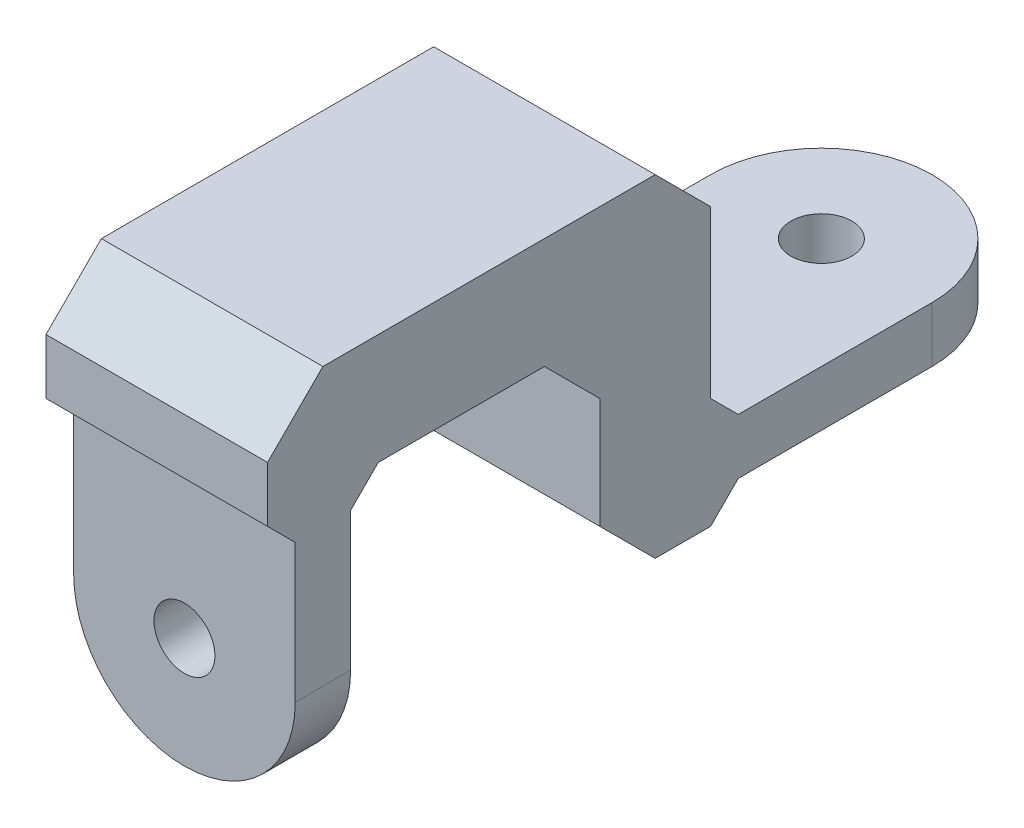
ISO-10303-21;
HEADER;
FILE_DESCRIPTION(('STEP AP214'),'2;1');
FILE_NAME('part.step','',(''),(''),'','','');
FILE_SCHEMA(('AUTOMOTIVE_DESIGN { 1 0 10303 214 1 1 1 1 }'));
ENDSEC;
DATA;
#1=APPLICATION_CONTEXT('core data for automotive mechanical design processes');
#2=APPLICATION_PROTOCOL_DEFINITION('international standard','automotive_design',2000,#1);
#3=PRODUCT_CONTEXT('',#1,'mechanical');
#4=PRODUCT('Part','Part','',(#3));
#5=PRODUCT_RELATED_PRODUCT_CATEGORY('part','',(#4));
#6=PRODUCT_DEFINITION_FORMATION('','',#4);
#7=PRODUCT_DEFINITION_CONTEXT('part definition',#1,'design');
#8=PRODUCT_DEFINITION('design','',#6,#7);
#9=PRODUCT_DEFINITION_SHAPE('','',#8);
#10=(LENGTH_UNIT() NAMED_UNIT(*) SI_UNIT(.MILLI.,.METRE.));
#11=(NAMED_UNIT(*) PLANE_ANGLE_UNIT() SI_UNIT($,.RADIAN.));
#12=(NAMED_UNIT(*) SI_UNIT($,.STERADIAN.) SOLID_ANGLE_UNIT());
#13=UNCERTAINTY_MEASURE_WITH_UNIT(LENGTH_MEASURE(1.E-05),#10,'distance_accuracy_value','');
#14=(GEOMETRIC_REPRESENTATION_CONTEXT(3) GLOBAL_UNCERTAINTY_ASSIGNED_CONTEXT((#13)) GLOBAL_UNIT_ASSIGNED_CONTEXT((#10,
#11,#12)) REPRESENTATION_CONTEXT('',''));
#15=CARTESIAN_POINT('',(0.,0.,0.));
#16=DIRECTION('',(0.,0.,1.));
#17=DIRECTION('',(1.,0.,0.));
#18=AXIS2_PLACEMENT_3D('',#15,#16,#17);
#19=CARTESIAN_POINT('',(-10.,-5.,10.));
#20=DIRECTION('',(1.,0.,0.));
#21=DIRECTION('',(0.,0.,-1.));
#22=AXIS2_PLACEMENT_3D('',#19,#20,#21);
#23=PLANE('',#22);
#24=DIRECTION('',(0.,0.,-1.));
#25=VECTOR('',#24,1.);
#26=CARTESIAN_POINT('',(-10.,-5.,10.));
#27=LINE('',#26,#25);
#28=CARTESIAN_POINT('',(-10.,-5.,15.));
#29=VERTEX_POINT('',#28);
#30=CARTESIAN_POINT('',(-10.,-5.,10.0000000000002));
#31=VERTEX_POINT('',#30);
#32=EDGE_CURVE('E253',#29,#31,#27,.T.);
#33=ORIENTED_EDGE('',*,*,#32,.F.);
#34=DIRECTION('',(0.,0.707106781186548,0.707106781186547));
#35=VECTOR('',#34,1.);
#36=CARTESIAN_POINT('',(-10.,-5.,15.));
#37=LINE('',#36,#35);
#38=CARTESIAN_POINT('',(-10.,0.,20.));
#39=VERTEX_POINT('',#38);
#40=EDGE_CURVE('E369',#29,#39,#37,.T.);
#41=ORIENTED_EDGE('',*,*,#40,.T.);
#42=DIRECTION('',(0.,1.,0.));
#43=VECTOR('',#42,1.);
#44=CARTESIAN_POINT('',(-10.,-5.,20.));
#45=LINE('',#44,#43);
#46=CARTESIAN_POINT('',(-10.,9.99999999999997,20.));
#47=VERTEX_POINT('',#46);
#48=EDGE_CURVE('E204',#39,#47,#45,.T.);
#49=ORIENTED_EDGE('',*,*,#48,.T.);
#50=DIRECTION('',(0.,-0.707106781186551,-0.707106781186544));
#51=VECTOR('',#50,1.);
#52=CARTESIAN_POINT('',(-10.,-2.50000000000008,7.50000000000006));
#53=LINE('',#52,#51);
#54=CARTESIAN_POINT('',(-10.,15.,25.));
#55=VERTEX_POINT('',#54);
#56=EDGE_CURVE('E50',#47,#55,#53,.F.);
#57=ORIENTED_EDGE('',*,*,#56,.T.);
#58=DIRECTION('',(0.,0.,1.));
#59=VECTOR('',#58,1.);
#60=CARTESIAN_POINT('',(-10.,15.,20.));
#61=LINE('',#60,#59);
#62=CARTESIAN_POINT('',(-10.,15.,40.));
#63=VERTEX_POINT('',#62);
#64=EDGE_CURVE('E192',#55,#63,#61,.T.);
#65=ORIENTED_EDGE('',*,*,#64,.T.);
#66=DIRECTION('',(0.,0.707106781186551,-0.707106781186544));
#67=VECTOR('',#66,1.);
#68=CARTESIAN_POINT('',(-10.,15.0000000000001,40.));
#69=LINE('',#68,#67);
#70=CARTESIAN_POINT('',(-10.,12.5000000000001,42.5));
#71=VERTEX_POINT('',#70);
#72=EDGE_CURVE('E196',#63,#71,#69,.F.);
#73=ORIENTED_EDGE('',*,*,#72,.T.);
#74=DIRECTION('',(0.,1.,0.));
#75=VECTOR('',#74,1.);
#76=CARTESIAN_POINT('',(-10.,-10.,42.5));
#77=LINE('',#76,#75);
#78=CARTESIAN_POINT('',(-10.,0.,42.5));
#79=VERTEX_POINT('',#78);
#80=EDGE_CURVE('E285',#79,#71,#77,.T.);
#81=ORIENTED_EDGE('',*,*,#80,.F.);
#82=DIRECTION('',(0.,0.,-1.));
#83=VECTOR('',#82,1.);
#84=CARTESIAN_POINT('',(-10.,0.,47.5));
#85=LINE('',#84,#83);
#86=CARTESIAN_POINT('',(-10.,0.,47.5));
#87=VERTEX_POINT('',#86);
#88=EDGE_CURVE('E328',#79,#87,#85,.F.);
#89=ORIENTED_EDGE('',*,*,#88,.T.);
#90=DIRECTION('',(0.,1.,0.));
#91=VECTOR('',#90,1.);
#92=CARTESIAN_POINT('',(-10.,-10.,47.5));
#93=LINE('',#92,#91);
#94=CARTESIAN_POINT('',(-10.,12.5000000000001,47.5));
#95=VERTEX_POINT('',#94);
#96=EDGE_CURVE('E335',#87,#95,#93,.T.);
#97=ORIENTED_EDGE('',*,*,#96,.T.);
#98=DIRECTION('',(0.,-0.707106781186543,-0.707106781186552));
#99=VECTOR('',#98,1.);
#100=CARTESIAN_POINT('',(-10.,10.,44.9999999999999));
#101=LINE('',#100,#99);
#102=CARTESIAN_POINT('',(-10.,15.,50.));
#103=VERTEX_POINT('',#102);
#104=EDGE_CURVE('E215',#95,#103,#101,.F.);
#105=ORIENTED_EDGE('',*,*,#104,.T.);
#106=DIRECTION('',(0.,1.,0.));
#107=VECTOR('',#106,1.);
#108=CARTESIAN_POINT('',(-10.,10.,50.));
#109=LINE('',#108,#107);
#110=CARTESIAN_POINT('',(-10.,20.,50.));
#111=VERTEX_POINT('',#110);
#112=EDGE_CURVE('E203',#103,#111,#109,.T.);
#113=ORIENTED_EDGE('',*,*,#112,.T.);
#114=DIRECTION('',(0.,-0.707106781186547,0.707106781186548));
#115=VECTOR('',#114,1.);
#116=CARTESIAN_POINT('',(-10.,20.,50.));
#117=LINE('',#116,#115);
#118=CARTESIAN_POINT('',(-10.,25.,45.));
#119=VERTEX_POINT('',#118);
#120=EDGE_CURVE('E363',#111,#119,#117,.F.);
#121=ORIENTED_EDGE('',*,*,#120,.T.);
#122=DIRECTION('',(0.,0.,-1.));
#123=VECTOR('',#122,1.);
#124=CARTESIAN_POINT('',(-10.,25.,50.));
#125=LINE('',#124,#123);
#126=CARTESIAN_POINT('',(-10.,25.,15.));
#127=VERTEX_POINT('',#126);
#128=EDGE_CURVE('E223',#119,#127,#125,.T.);
#129=ORIENTED_EDGE('',*,*,#128,.T.);
#130=DIRECTION('',(0.,0.707106781186549,0.707106781186547));
#131=VECTOR('',#130,1.);
#132=CARTESIAN_POINT('',(-10.,25.,15.));
#133=LINE('',#132,#131);
#134=CARTESIAN_POINT('',(-10.,20.,10.));
#135=VERTEX_POINT('',#134);
#136=EDGE_CURVE('E366',#127,#135,#133,.F.);
#137=ORIENTED_EDGE('',*,*,#136,.T.);
#138=DIRECTION('',(0.,-1.,0.));
#139=VECTOR('',#138,1.);
#140=CARTESIAN_POINT('',(-10.,-5.,10.));
#141=LINE('',#140,#139);
#142=CARTESIAN_POINT('',(-10.,5.,10.));
#143=VERTEX_POINT('',#142);
#144=EDGE_CURVE('E417',#135,#143,#141,.T.);
#145=ORIENTED_EDGE('',*,*,#144,.T.);
#146=DIRECTION('',(0.,-0.707106781186544,-0.707106781186551));
#147=VECTOR('',#146,1.);
#148=CARTESIAN_POINT('',(-10.,5.,10.0000000000002));
#149=LINE('',#148,#147);
#150=CARTESIAN_POINT('',(-10.,2.5,7.50000000000015));
#151=VERTEX_POINT('',#150);
#152=EDGE_CURVE('E289',#143,#151,#149,.T.);
#153=ORIENTED_EDGE('',*,*,#152,.T.);
#154=DIRECTION('',(0.,0.,1.));
#155=VECTOR('',#154,1.);
#156=CARTESIAN_POINT('',(-10.,2.5,-20.));
#157=LINE('',#156,#155);
#158=CARTESIAN_POINT('',(-10.,2.5,-10.));
#159=VERTEX_POINT('',#158);
#160=EDGE_CURVE('E236',#159,#151,#157,.T.);
#161=ORIENTED_EDGE('',*,*,#160,.F.);
#162=DIRECTION('',(0.,1.,0.));
#163=VECTOR('',#162,1.);
#164=CARTESIAN_POINT('',(-10.,-2.5,-10.));
#165=LINE('',#164,#163);
#166=CARTESIAN_POINT('',(-10.,-2.5,-10.));
#167=VERTEX_POINT('',#166);
#168=EDGE_CURVE('E262',#159,#167,#165,.F.);
#169=ORIENTED_EDGE('',*,*,#168,.T.);
#170=DIRECTION('',(0.,0.,1.));
#171=VECTOR('',#170,1.);
#172=CARTESIAN_POINT('',(-10.,-2.5,-20.));
#173=LINE('',#172,#171);
#174=CARTESIAN_POINT('',(-10.,-2.5,7.50000000000015));
#175=VERTEX_POINT('',#174);
#176=EDGE_CURVE('E240',#167,#175,#173,.T.);
#177=ORIENTED_EDGE('',*,*,#176,.T.);
#178=DIRECTION('',(0.,-0.707106781186544,0.707106781186551));
#179=VECTOR('',#178,1.);
#180=CARTESIAN_POINT('',(-10.,-5.,10.0000000000002));
#181=LINE('',#180,#179);
#182=EDGE_CURVE('E275',#175,#31,#181,.T.);
#183=ORIENTED_EDGE('',*,*,#182,.T.);
#184=EDGE_LOOP('',(#33,#41,#49,#57,#65,#73,#81,#89,#97,#105,#113,#121,#129,#137,#145,#153,#161,
#169,#177,#183));
#185=FACE_BOUND('',#184,.T.);
#186=ADVANCED_FACE('F41',(#185),#23,.F.);
#187=CARTESIAN_POINT('',(-10.,-5.,10.));
#188=DIRECTION('',(0.,1.,0.));
#189=DIRECTION('',(0.,0.,1.));
#190=AXIS2_PLACEMENT_3D('',#187,#188,#189);
#191=PLANE('',#190);
#192=DIRECTION('',(0.,0.,-1.));
#193=VECTOR('',#192,1.);
#194=CARTESIAN_POINT('',(10.,-5.,10.));
#195=LINE('',#194,#193);
#196=CARTESIAN_POINT('',(10.,-5.,15.));
#197=VERTEX_POINT('',#196);
#198=CARTESIAN_POINT('',(10.,-5.,10.0000000000002));
#199=VERTEX_POINT('',#198);
#200=EDGE_CURVE('E250',#197,#199,#195,.T.);
#201=ORIENTED_EDGE('',*,*,#200,.F.);
#202=DIRECTION('',(-1.,0.,0.));
#203=VECTOR('',#202,1.);
#204=CARTESIAN_POINT('',(-10.,-5.,15.));
#205=LINE('',#204,#203);
#206=EDGE_CURVE('E359',#197,#29,#205,.T.);
#207=ORIENTED_EDGE('',*,*,#206,.T.);
#208=ORIENTED_EDGE('',*,*,#32,.T.);
#209=DIRECTION('',(1.,0.,0.));
#210=VECTOR('',#209,1.);
#211=CARTESIAN_POINT('',(10.,-5.,10.0000000000002));
#212=LINE('',#211,#210);
#213=EDGE_CURVE('E300',#31,#199,#212,.T.);
#214=ORIENTED_EDGE('',*,*,#213,.T.);
#215=EDGE_LOOP('',(#201,#207,#208,#214));
#216=FACE_BOUND('',#215,.T.);
#217=ADVANCED_FACE('F446',(#216),#191,.F.);
#218=CARTESIAN_POINT('',(10.,-5.,10.));
#219=DIRECTION('',(-1.,0.,0.));
#220=DIRECTION('',(0.,0.,1.));
#221=AXIS2_PLACEMENT_3D('',#218,#219,#220);
#222=PLANE('',#221);
#223=DIRECTION('',(0.,-1.,0.));
#224=VECTOR('',#223,1.);
#225=CARTESIAN_POINT('',(10.,-5.,20.));
#226=LINE('',#225,#224);
#227=CARTESIAN_POINT('',(10.,9.99999999999997,20.));
#228=VERTEX_POINT('',#227);
#229=CARTESIAN_POINT('',(10.,0.,20.));
#230=VERTEX_POINT('',#229);
#231=EDGE_CURVE('E222',#228,#230,#226,.T.);
#232=ORIENTED_EDGE('',*,*,#231,.T.);
#233=DIRECTION('',(0.,-0.707106781186548,-0.707106781186547));
#234=VECTOR('',#233,1.);
#235=CARTESIAN_POINT('',(10.,-5.,15.));
#236=LINE('',#235,#234);
#237=EDGE_CURVE('E384',#230,#197,#236,.T.);
#238=ORIENTED_EDGE('',*,*,#237,.T.);
#239=ORIENTED_EDGE('',*,*,#200,.T.);
#240=DIRECTION('',(0.,0.707106781186544,-0.707106781186551));
#241=VECTOR('',#240,1.);
#242=CARTESIAN_POINT('',(10.,-5.,10.0000000000002));
#243=LINE('',#242,#241);
#244=CARTESIAN_POINT('',(10.,-2.5,7.50000000000015));
#245=VERTEX_POINT('',#244);
#246=EDGE_CURVE('E293',#199,#245,#243,.T.);
#247=ORIENTED_EDGE('',*,*,#246,.T.);
#248=DIRECTION('',(0.,0.,1.));
#249=VECTOR('',#248,1.);
#250=CARTESIAN_POINT('',(10.,-2.5,-20.));
#251=LINE('',#250,#249);
#252=CARTESIAN_POINT('',(10.,-2.5,-10.));
#253=VERTEX_POINT('',#252);
#254=EDGE_CURVE('E243',#253,#245,#251,.T.);
#255=ORIENTED_EDGE('',*,*,#254,.F.);
#256=DIRECTION('',(0.,-1.,0.));
#257=VECTOR('',#256,1.);
#258=CARTESIAN_POINT('',(10.,2.5,-10.));
#259=LINE('',#258,#257);
#260=CARTESIAN_POINT('',(10.,2.5,-10.));
#261=VERTEX_POINT('',#260);
#262=EDGE_CURVE('E272',#253,#261,#259,.F.);
#263=ORIENTED_EDGE('',*,*,#262,.T.);
#264=DIRECTION('',(0.,0.,1.));
#265=VECTOR('',#264,1.);
#266=CARTESIAN_POINT('',(10.,2.5,-20.));
#267=LINE('',#266,#265);
#268=CARTESIAN_POINT('',(10.,2.5,7.50000000000015));
#269=VERTEX_POINT('',#268);
#270=EDGE_CURVE('E233',#261,#269,#267,.T.);
#271=ORIENTED_EDGE('',*,*,#270,.T.);
#272=DIRECTION('',(0.,0.707106781186544,0.707106781186551));
#273=VECTOR('',#272,1.);
#274=CARTESIAN_POINT('',(10.,5.,10.0000000000002));
#275=LINE('',#274,#273);
#276=CARTESIAN_POINT('',(10.,5.,10.));
#277=VERTEX_POINT('',#276);
#278=EDGE_CURVE('E297',#269,#277,#275,.T.);
#279=ORIENTED_EDGE('',*,*,#278,.T.);
#280=DIRECTION('',(0.,1.,0.));
#281=VECTOR('',#280,1.);
#282=CARTESIAN_POINT('',(10.,-5.,10.));
#283=LINE('',#282,#281);
#284=CARTESIAN_POINT('',(10.,20.,10.));
#285=VERTEX_POINT('',#284);
#286=EDGE_CURVE('E279',#277,#285,#283,.T.);
#287=ORIENTED_EDGE('',*,*,#286,.T.);
#288=DIRECTION('',(0.,-0.707106781186549,-0.707106781186547));
#289=VECTOR('',#288,1.);
#290=CARTESIAN_POINT('',(10.,25.,15.));
#291=LINE('',#290,#289);
#292=CARTESIAN_POINT('',(10.,25.,15.));
#293=VERTEX_POINT('',#292);
#294=EDGE_CURVE('E381',#285,#293,#291,.F.);
#295=ORIENTED_EDGE('',*,*,#294,.T.);
#296=DIRECTION('',(0.,0.,1.));
#297=VECTOR('',#296,1.);
#298=CARTESIAN_POINT('',(10.,25.,50.));
#299=LINE('',#298,#297);
#300=CARTESIAN_POINT('',(10.,25.,45.));
#301=VERTEX_POINT('',#300);
#302=EDGE_CURVE('E406',#293,#301,#299,.T.);
#303=ORIENTED_EDGE('',*,*,#302,.T.);
#304=DIRECTION('',(0.,0.707106781186547,-0.707106781186548));
#305=VECTOR('',#304,1.);
#306=CARTESIAN_POINT('',(10.,20.,50.));
#307=LINE('',#306,#305);
#308=CARTESIAN_POINT('',(10.,20.,50.));
#309=VERTEX_POINT('',#308);
#310=EDGE_CURVE('E57',#301,#309,#307,.F.);
#311=ORIENTED_EDGE('',*,*,#310,.T.);
#312=DIRECTION('',(0.,-1.,0.));
#313=VECTOR('',#312,1.);
#314=CARTESIAN_POINT('',(10.,10.,50.));
#315=LINE('',#314,#313);
#316=CARTESIAN_POINT('',(10.,15.,50.));
#317=VERTEX_POINT('',#316);
#318=EDGE_CURVE('E409',#309,#317,#315,.T.);
#319=ORIENTED_EDGE('',*,*,#318,.T.);
#320=DIRECTION('',(0.,0.707106781186543,0.707106781186552));
#321=VECTOR('',#320,1.);
#322=CARTESIAN_POINT('',(10.,10.,44.9999999999999));
#323=LINE('',#322,#321);
#324=CARTESIAN_POINT('',(10.,12.5000000000001,47.5));
#325=VERTEX_POINT('',#324);
#326=EDGE_CURVE('E214',#317,#325,#323,.F.);
#327=ORIENTED_EDGE('',*,*,#326,.T.);
#328=DIRECTION('',(0.,1.,0.));
#329=VECTOR('',#328,1.);
#330=CARTESIAN_POINT('',(10.,-10.,47.5));
#331=LINE('',#330,#329);
#332=CARTESIAN_POINT('',(10.,0.,47.5));
#333=VERTEX_POINT('',#332);
#334=EDGE_CURVE('E435',#333,#325,#331,.T.);
#335=ORIENTED_EDGE('',*,*,#334,.F.);
#336=DIRECTION('',(0.,0.,1.));
#337=VECTOR('',#336,1.);
#338=CARTESIAN_POINT('',(10.,0.,42.5));
#339=LINE('',#338,#337);
#340=CARTESIAN_POINT('',(10.,0.,42.5));
#341=VERTEX_POINT('',#340);
#342=EDGE_CURVE('E318',#333,#341,#339,.F.);
#343=ORIENTED_EDGE('',*,*,#342,.T.);
#344=DIRECTION('',(0.,1.,0.));
#345=VECTOR('',#344,1.);
#346=CARTESIAN_POINT('',(10.,-10.,42.5));
#347=LINE('',#346,#345);
#348=CARTESIAN_POINT('',(10.,12.5000000000001,42.5));
#349=VERTEX_POINT('',#348);
#350=EDGE_CURVE('E741',#341,#349,#347,.T.);
#351=ORIENTED_EDGE('',*,*,#350,.T.);
#352=DIRECTION('',(0.,-0.707106781186551,0.707106781186544));
#353=VECTOR('',#352,1.);
#354=CARTESIAN_POINT('',(10.,15.0000000000001,40.));
#355=LINE('',#354,#353);
#356=CARTESIAN_POINT('',(10.,15.,40.));
#357=VERTEX_POINT('',#356);
#358=EDGE_CURVE('E346',#349,#357,#355,.F.);
#359=ORIENTED_EDGE('',*,*,#358,.T.);
#360=DIRECTION('',(0.,0.,-1.));
#361=VECTOR('',#360,1.);
#362=CARTESIAN_POINT('',(10.,15.,20.));
#363=LINE('',#362,#361);
#364=CARTESIAN_POINT('',(10.,15.,25.));
#365=VERTEX_POINT('',#364);
#366=EDGE_CURVE('E220',#357,#365,#363,.T.);
#367=ORIENTED_EDGE('',*,*,#366,.T.);
#368=DIRECTION('',(0.,0.707106781186551,0.707106781186544));
#369=VECTOR('',#368,1.);
#370=CARTESIAN_POINT('',(10.,-2.50000000000008,7.50000000000006));
#371=LINE('',#370,#369);
#372=EDGE_CURVE('E11',#365,#228,#371,.F.);
#373=ORIENTED_EDGE('',*,*,#372,.T.);
#374=EDGE_LOOP('',(#232,#238,#239,#247,#255,#263,#271,#279,#287,#295,#303,#311,#319,#327,#335,
#343,#351,#359,#367,#373));
#375=FACE_BOUND('',#374,.T.);
#376=ADVANCED_FACE('F434',(#375),#222,.F.);
#377=CARTESIAN_POINT('',(10.,-2.5,-20.));
#378=DIRECTION('',(0.,1.,0.));
#379=DIRECTION('',(0.,0.,1.));
#380=AXIS2_PLACEMENT_3D('',#377,#378,#379);
#381=PLANE('',#380);
#382=CARTESIAN_POINT('',(0.,-2.5,-10.));
#383=DIRECTION('',(0.,1.,0.));
#384=DIRECTION('',(0.,0.,1.));
#385=AXIS2_PLACEMENT_3D('',#382,#383,#384);
#386=CIRCLE('',#385,2.75);
#387=CARTESIAN_POINT('',(0.,-2.5,-7.25));
#388=VERTEX_POINT('',#387);
#389=EDGE_CURVE('E284',#388,#388,#386,.T.);
#390=ORIENTED_EDGE('',*,*,#389,.T.);
#391=EDGE_LOOP('',(#390));
#392=FACE_BOUND('',#391,.T.);
#393=ORIENTED_EDGE('',*,*,#176,.F.);
#394=CARTESIAN_POINT('',(0.,-2.5,-10.));
#395=DIRECTION('',(0.,1.,0.));
#396=DIRECTION('',(0.,0.,1.));
#397=AXIS2_PLACEMENT_3D('',#394,#395,#396);
#398=CIRCLE('',#397,10.);
#399=CARTESIAN_POINT('',(0.,-2.5,-20.));
#400=VERTEX_POINT('',#399);
#401=EDGE_CURVE('E269',#167,#400,#398,.F.);
#402=ORIENTED_EDGE('',*,*,#401,.T.);
#403=CARTESIAN_POINT('',(0.,-2.5,-10.));
#404=DIRECTION('',(0.,1.,0.));
#405=DIRECTION('',(0.,0.,1.));
#406=AXIS2_PLACEMENT_3D('',#403,#404,#405);
#407=CIRCLE('',#406,10.);
#408=EDGE_CURVE('E266',#400,#253,#407,.F.);
#409=ORIENTED_EDGE('',*,*,#408,.T.);
#410=ORIENTED_EDGE('',*,*,#254,.T.);
#411=DIRECTION('',(-1.,0.,0.));
#412=VECTOR('',#411,1.);
#413=CARTESIAN_POINT('',(10.,-2.5,7.50000000000015));
#414=LINE('',#413,#412);
#415=EDGE_CURVE('E308',#245,#175,#414,.T.);
#416=ORIENTED_EDGE('',*,*,#415,.T.);
#417=EDGE_LOOP('',(#393,#402,#409,#410,#416));
#418=FACE_BOUND('',#417,.T.);
#419=ADVANCED_FACE('F549',(#392,#418),#381,.F.);
#420=CARTESIAN_POINT('',(10.,2.5,-20.));
#421=DIRECTION('',(0.,-1.,0.));
#422=DIRECTION('',(0.,0.,-1.));
#423=AXIS2_PLACEMENT_3D('',#420,#421,#422);
#424=PLANE('',#423);
#425=CARTESIAN_POINT('',(0.,2.5,-10.));
#426=DIRECTION('',(0.,-1.,0.));
#427=DIRECTION('',(0.,0.,-1.));
#428=AXIS2_PLACEMENT_3D('',#425,#426,#427);
#429=CIRCLE('',#428,2.75);
#430=CARTESIAN_POINT('',(0.,2.5,-7.25));
#431=VERTEX_POINT('',#430);
#432=EDGE_CURVE('E280',#431,#431,#429,.T.);
#433=ORIENTED_EDGE('',*,*,#432,.T.);
#434=EDGE_LOOP('',(#433));
#435=FACE_BOUND('',#434,.T.);
#436=CARTESIAN_POINT('',(0.,2.5,-10.));
#437=DIRECTION('',(0.,-1.,0.));
#438=DIRECTION('',(0.,0.,-1.));
#439=AXIS2_PLACEMENT_3D('',#436,#437,#438);
#440=CIRCLE('',#439,10.);
#441=CARTESIAN_POINT('',(0.,2.5,-20.));
#442=VERTEX_POINT('',#441);
#443=EDGE_CURVE('E256',#261,#442,#440,.F.);
#444=ORIENTED_EDGE('',*,*,#443,.T.);
#445=CARTESIAN_POINT('',(0.,2.5,-10.));
#446=DIRECTION('',(0.,-1.,0.));
#447=DIRECTION('',(0.,0.,-1.));
#448=AXIS2_PLACEMENT_3D('',#445,#446,#447);
#449=CIRCLE('',#448,10.);
#450=EDGE_CURVE('E259',#442,#159,#449,.F.);
#451=ORIENTED_EDGE('',*,*,#450,.T.);
#452=ORIENTED_EDGE('',*,*,#160,.T.);
#453=DIRECTION('',(1.,0.,0.));
#454=VECTOR('',#453,1.);
#455=CARTESIAN_POINT('',(10.,2.5,7.50000000000015));
#456=LINE('',#455,#454);
#457=EDGE_CURVE('E304',#151,#269,#456,.T.);
#458=ORIENTED_EDGE('',*,*,#457,.T.);
#459=ORIENTED_EDGE('',*,*,#270,.F.);
#460=EDGE_LOOP('',(#444,#451,#452,#458,#459));
#461=FACE_BOUND('',#460,.T.);
#462=ADVANCED_FACE('F463',(#435,#461),#424,.F.);
#463=CARTESIAN_POINT('',(0.,0.,-10.));
#464=DIRECTION('',(0.,1.,0.));
#465=DIRECTION('',(0.,0.,1.));
#466=AXIS2_PLACEMENT_3D('',#463,#464,#465);
#467=CYLINDRICAL_SURFACE('',#466,10.);
#468=ORIENTED_EDGE('',*,*,#262,.F.);
#469=ORIENTED_EDGE('',*,*,#408,.F.);
#470=DIRECTION('',(0.,-1.,0.));
#471=VECTOR('',#470,1.);
#472=CARTESIAN_POINT('',(0.,-2.5,-20.));
#473=LINE('',#472,#471);
#474=EDGE_CURVE('E237',#442,#400,#473,.T.);
#475=ORIENTED_EDGE('',*,*,#474,.F.);
#476=ORIENTED_EDGE('',*,*,#443,.F.);
#477=EDGE_LOOP('',(#468,#469,#475,#476));
#478=FACE_BOUND('',#477,.T.);
#479=ADVANCED_FACE('F459',(#478),#467,.T.);
#480=CARTESIAN_POINT('',(0.,0.,-10.));
#481=DIRECTION('',(0.,-1.,0.));
#482=DIRECTION('',(0.,0.,-1.));
#483=AXIS2_PLACEMENT_3D('',#480,#481,#482);
#484=CYLINDRICAL_SURFACE('',#483,10.);
#485=ORIENTED_EDGE('',*,*,#401,.F.);
#486=ORIENTED_EDGE('',*,*,#168,.F.);
#487=ORIENTED_EDGE('',*,*,#450,.F.);
#488=ORIENTED_EDGE('',*,*,#474,.T.);
#489=EDGE_LOOP('',(#485,#486,#487,#488));
#490=FACE_BOUND('',#489,.T.);
#491=ADVANCED_FACE('F456',(#490),#484,.T.);
#492=CARTESIAN_POINT('',(60.,-5.,10.));
#493=DIRECTION('',(0.,0.,-1.));
#494=DIRECTION('',(0.,1.,0.));
#495=AXIS2_PLACEMENT_3D('',#492,#493,#494);
#496=PLANE('',#495);
#497=ORIENTED_EDGE('',*,*,#144,.F.);
#498=DIRECTION('',(1.,0.,0.));
#499=VECTOR('',#498,1.);
#500=CARTESIAN_POINT('',(60.,20.,10.));
#501=LINE('',#500,#499);
#502=EDGE_CURVE('E396',#135,#285,#501,.T.);
#503=ORIENTED_EDGE('',*,*,#502,.T.);
#504=ORIENTED_EDGE('',*,*,#286,.F.);
#505=DIRECTION('',(-1.,0.,0.));
#506=VECTOR('',#505,1.);
#507=CARTESIAN_POINT('',(-10.,5.,10.));
#508=LINE('',#507,#506);
#509=EDGE_CURVE('E246',#277,#143,#508,.T.);
#510=ORIENTED_EDGE('',*,*,#509,.T.);
#511=EDGE_LOOP('',(#497,#503,#504,#510));
#512=FACE_BOUND('',#511,.T.);
#513=ADVANCED_FACE('F458',(#512),#496,.T.);
#514=CARTESIAN_POINT('',(60.,25.,50.));
#515=DIRECTION('',(0.,1.,0.));
#516=DIRECTION('',(0.,0.,1.));
#517=AXIS2_PLACEMENT_3D('',#514,#515,#516);
#518=PLANE('',#517);
#519=ORIENTED_EDGE('',*,*,#302,.F.);
#520=DIRECTION('',(-1.,0.,0.));
#521=VECTOR('',#520,1.);
#522=CARTESIAN_POINT('',(60.,25.,15.));
#523=LINE('',#522,#521);
#524=EDGE_CURVE('E392',#293,#127,#523,.T.);
#525=ORIENTED_EDGE('',*,*,#524,.T.);
#526=ORIENTED_EDGE('',*,*,#128,.F.);
#527=DIRECTION('',(1.,0.,0.));
#528=VECTOR('',#527,1.);
#529=CARTESIAN_POINT('',(60.,25.,45.));
#530=LINE('',#529,#528);
#531=EDGE_CURVE('E65',#119,#301,#530,.T.);
#532=ORIENTED_EDGE('',*,*,#531,.T.);
#533=EDGE_LOOP('',(#519,#525,#526,#532));
#534=FACE_BOUND('',#533,.T.);
#535=ADVANCED_FACE('F531',(#534),#518,.T.);
#536=CARTESIAN_POINT('',(60.,10.,50.));
#537=DIRECTION('',(0.,0.,1.));
#538=DIRECTION('',(0.,-1.,0.));
#539=AXIS2_PLACEMENT_3D('',#536,#537,#538);
#540=PLANE('',#539);
#541=ORIENTED_EDGE('',*,*,#318,.F.);
#542=DIRECTION('',(-1.,0.,0.));
#543=VECTOR('',#542,1.);
#544=CARTESIAN_POINT('',(60.,20.,50.));
#545=LINE('',#544,#543);
#546=EDGE_CURVE('E399',#309,#111,#545,.T.);
#547=ORIENTED_EDGE('',*,*,#546,.T.);
#548=ORIENTED_EDGE('',*,*,#112,.F.);
#549=DIRECTION('',(1.,0.,0.));
#550=VECTOR('',#549,1.);
#551=CARTESIAN_POINT('',(60.,15.,50.));
#552=LINE('',#551,#550);
#553=EDGE_CURVE('E349',#103,#317,#552,.T.);
#554=ORIENTED_EDGE('',*,*,#553,.T.);
#555=EDGE_LOOP('',(#541,#547,#548,#554));
#556=FACE_BOUND('',#555,.T.);
#557=ADVANCED_FACE('F427',(#556),#540,.T.);
#558=CARTESIAN_POINT('',(60.,15.,20.));
#559=DIRECTION('',(0.,-1.,0.));
#560=DIRECTION('',(0.,0.,-1.));
#561=AXIS2_PLACEMENT_3D('',#558,#559,#560);
#562=PLANE('',#561);
#563=ORIENTED_EDGE('',*,*,#64,.F.);
#564=DIRECTION('',(1.,0.,0.));
#565=VECTOR('',#564,1.);
#566=CARTESIAN_POINT('',(10.,15.,25.));
#567=LINE('',#566,#565);
#568=EDGE_CURVE('E387',#55,#365,#567,.T.);
#569=ORIENTED_EDGE('',*,*,#568,.T.);
#570=ORIENTED_EDGE('',*,*,#366,.F.);
#571=DIRECTION('',(-1.,0.,0.));
#572=VECTOR('',#571,1.);
#573=CARTESIAN_POINT('',(60.,15.,40.));
#574=LINE('',#573,#572);
#575=EDGE_CURVE('E210',#357,#63,#574,.T.);
#576=ORIENTED_EDGE('',*,*,#575,.T.);
#577=EDGE_LOOP('',(#563,#569,#570,#576));
#578=FACE_BOUND('',#577,.T.);
#579=ADVANCED_FACE('F218',(#578),#562,.T.);
#580=CARTESIAN_POINT('',(60.,-5.,20.));
#581=DIRECTION('',(0.,0.,1.));
#582=DIRECTION('',(0.,-1.,0.));
#583=AXIS2_PLACEMENT_3D('',#580,#581,#582);
#584=PLANE('',#583);
#585=ORIENTED_EDGE('',*,*,#48,.F.);
#586=DIRECTION('',(1.,0.,0.));
#587=VECTOR('',#586,1.);
#588=CARTESIAN_POINT('',(10.,0.,20.));
#589=LINE('',#588,#587);
#590=EDGE_CURVE('E376',#39,#230,#589,.T.);
#591=ORIENTED_EDGE('',*,*,#590,.T.);
#592=ORIENTED_EDGE('',*,*,#231,.F.);
#593=DIRECTION('',(-1.,0.,0.));
#594=VECTOR('',#593,1.);
#595=CARTESIAN_POINT('',(-10.,9.99999999999998,20.));
#596=LINE('',#595,#594);
#597=EDGE_CURVE('E372',#228,#47,#596,.T.);
#598=ORIENTED_EDGE('',*,*,#597,.T.);
#599=EDGE_LOOP('',(#585,#591,#592,#598));
#600=FACE_BOUND('',#599,.T.);
#601=ADVANCED_FACE('F502',(#600),#584,.T.);
#602=CARTESIAN_POINT('',(0.,-5.,-10.));
#603=DIRECTION('',(0.,1.,0.));
#604=DIRECTION('',(0.,0.,1.));
#605=AXIS2_PLACEMENT_3D('',#602,#603,#604);
#606=CYLINDRICAL_SURFACE('',#605,2.75);
#607=CARTESIAN_POINT('',(0.,2.5,-7.25));
#608=CARTESIAN_POINT('',(0.,2.44791666666667,-7.25));
#609=CARTESIAN_POINT('',(0.,2.39583333333333,-7.25));
#610=CARTESIAN_POINT('',(0.,2.29166666666667,-7.25));
#611=CARTESIAN_POINT('',(0.,2.23958333333333,-7.25));
#612=CARTESIAN_POINT('',(0.,2.13541666666667,-7.25));
#613=CARTESIAN_POINT('',(0.,2.08333333333333,-7.25));
#614=CARTESIAN_POINT('',(0.,1.97916666666667,-7.25));
#615=CARTESIAN_POINT('',(0.,1.92708333333333,-7.25));
#616=CARTESIAN_POINT('',(0.,1.82291666666667,-7.25));
#617=CARTESIAN_POINT('',(0.,1.77083333333333,-7.25));
#618=CARTESIAN_POINT('',(0.,1.66666666666667,-7.25));
#619=CARTESIAN_POINT('',(0.,1.61458333333333,-7.25));
#620=CARTESIAN_POINT('',(0.,1.51041666666667,-7.25));
#621=CARTESIAN_POINT('',(0.,1.45833333333333,-7.25));
#622=CARTESIAN_POINT('',(0.,1.35416666666667,-7.25));
#623=CARTESIAN_POINT('',(0.,1.30208333333333,-7.25));
#624=CARTESIAN_POINT('',(0.,1.19791666666667,-7.25));
#625=CARTESIAN_POINT('',(0.,1.14583333333333,-7.25));
#626=CARTESIAN_POINT('',(0.,1.04166666666667,-7.25));
#627=CARTESIAN_POINT('',(0.,0.989583333333333,-7.25));
#628=CARTESIAN_POINT('',(0.,0.885416666666667,-7.25));
#629=CARTESIAN_POINT('',(0.,0.833333333333333,-7.25));
#630=CARTESIAN_POINT('',(0.,0.729166666666667,-7.25));
#631=CARTESIAN_POINT('',(0.,0.677083333333333,-7.25));
#632=CARTESIAN_POINT('',(0.,0.572916666666666,-7.25));
#633=CARTESIAN_POINT('',(0.,0.520833333333333,-7.25));
#634=CARTESIAN_POINT('',(0.,0.416666666666666,-7.25));
#635=CARTESIAN_POINT('',(0.,0.364583333333333,-7.25));
#636=CARTESIAN_POINT('',(0.,0.260416666666667,-7.25));
#637=CARTESIAN_POINT('',(0.,0.208333333333334,-7.25));
#638=CARTESIAN_POINT('',(0.,0.104166666666667,-7.25));
#639=CARTESIAN_POINT('',(0.,0.0520833333333334,-7.25));
#640=CARTESIAN_POINT('',(0.,-0.0520833333333334,-7.25));
#641=CARTESIAN_POINT('',(0.,-0.104166666666667,-7.25));
#642=CARTESIAN_POINT('',(0.,-0.208333333333334,-7.25));
#643=CARTESIAN_POINT('',(0.,-0.260416666666667,-7.25));
#644=CARTESIAN_POINT('',(0.,-0.364583333333334,-7.25));
#645=CARTESIAN_POINT('',(0.,-0.416666666666667,-7.25));
#646=CARTESIAN_POINT('',(0.,-0.520833333333334,-7.25));
#647=CARTESIAN_POINT('',(0.,-0.572916666666667,-7.25));
#648=CARTESIAN_POINT('',(0.,-0.677083333333334,-7.25));
#649=CARTESIAN_POINT('',(0.,-0.729166666666667,-7.25));
#650=CARTESIAN_POINT('',(0.,-0.833333333333334,-7.25));
#651=CARTESIAN_POINT('',(0.,-0.885416666666668,-7.25));
#652=CARTESIAN_POINT('',(0.,-0.989583333333334,-7.25));
#653=CARTESIAN_POINT('',(0.,-1.04166666666667,-7.25));
#654=CARTESIAN_POINT('',(0.,-1.14583333333333,-7.25));
#655=CARTESIAN_POINT('',(0.,-1.19791666666667,-7.25));
#656=CARTESIAN_POINT('',(0.,-1.30208333333333,-7.25));
#657=CARTESIAN_POINT('',(0.,-1.35416666666667,-7.25));
#658=CARTESIAN_POINT('',(0.,-1.45833333333333,-7.25));
#659=CARTESIAN_POINT('',(0.,-1.51041666666667,-7.25));
#660=CARTESIAN_POINT('',(0.,-1.61458333333333,-7.25));
#661=CARTESIAN_POINT('',(0.,-1.66666666666667,-7.25));
#662=CARTESIAN_POINT('',(0.,-1.77083333333333,-7.25));
#663=CARTESIAN_POINT('',(0.,-1.82291666666667,-7.25));
#664=CARTESIAN_POINT('',(0.,-1.92708333333333,-7.25));
#665=CARTESIAN_POINT('',(0.,-1.97916666666667,-7.25));
#666=CARTESIAN_POINT('',(0.,-2.08333333333333,-7.25));
#667=CARTESIAN_POINT('',(0.,-2.13541666666667,-7.25));
#668=CARTESIAN_POINT('',(0.,-2.23958333333333,-7.25));
#669=CARTESIAN_POINT('',(0.,-2.29166666666667,-7.25));
#670=CARTESIAN_POINT('',(0.,-2.39583333333333,-7.25));
#671=CARTESIAN_POINT('',(0.,-2.44791666666667,-7.25));
#672=CARTESIAN_POINT('',(0.,-2.5,-7.25));
#673=B_SPLINE_CURVE_WITH_KNOTS('',3,(#607,#608,#609,#610,#611,#612,#613,#614,#615,#616,#617,
#618,#619,#620,#621,#622,#623,#624,#625,#626,#627,#628,#629,#630,#631,#632,#633,#634,#635,#636,
#637,#638,#639,#640,#641,#642,#643,#644,#645,#646,#647,#648,#649,#650,#651,#652,#653,#654,#655,
#656,#657,#658,#659,#660,#661,#662,#663,#664,#665,#666,#667,#668,#669,#670,#671,#672),
.UNSPECIFIED.,.F.,.F.,(4,2,2,2,2,2,2,2,2,2,2,2,2,2,2,2,2,2,2,2,2,2,2,2,2,2,2,2,2,2,2,2,4),(0.,
0.15625,0.3125,0.46875,0.625000000000001,0.781250000000001,0.937500000000001,1.09375,1.25,
1.40625,1.5625,1.71875,1.875,2.03125,2.1875,2.34375,2.5,2.65625,2.8125,2.96875,3.125,3.28125,
3.4375,3.59375,3.75,3.90625,4.0625,4.21875,4.375,4.53125,4.6875,4.84375,5.),.UNSPECIFIED.);
#674=EDGE_CURVE('BSEAM469',#431,#388,#673,.T.);
#675=ORIENTED_EDGE('',*,*,#432,.F.);
#676=ORIENTED_EDGE('',*,*,#389,.F.);
#677=ORIENTED_EDGE('',*,*,#674,.T.);
#678=ORIENTED_EDGE('',*,*,#674,.F.);
#679=EDGE_LOOP('',(#675,#677,#676,#678));
#680=FACE_BOUND('',#679,.T.);
#681=ADVANCED_FACE('F469',(#680),#606,.F.);
#682=CARTESIAN_POINT('',(-10.,5.,10.0000000000002));
#683=DIRECTION('',(0.,0.707106781186551,-0.707106781186544));
#684=DIRECTION('',(1.,0.,0.));
#685=AXIS2_PLACEMENT_3D('',#682,#683,#684);
#686=PLANE('',#685);
#687=ORIENTED_EDGE('',*,*,#278,.F.);
#688=ORIENTED_EDGE('',*,*,#457,.F.);
#689=ORIENTED_EDGE('',*,*,#152,.F.);
#690=ORIENTED_EDGE('',*,*,#509,.F.);
#691=EDGE_LOOP('',(#687,#688,#689,#690));
#692=FACE_BOUND('',#691,.T.);
#693=ADVANCED_FACE('F465',(#692),#686,.T.);
#694=CARTESIAN_POINT('',(-10.,-5.,10.0000000000002));
#695=DIRECTION('',(0.,-0.707106781186551,-0.707106781186544));
#696=DIRECTION('',(-1.,0.,0.));
#697=AXIS2_PLACEMENT_3D('',#694,#695,#696);
#698=PLANE('',#697);
#699=ORIENTED_EDGE('',*,*,#182,.F.);
#700=ORIENTED_EDGE('',*,*,#415,.F.);
#701=ORIENTED_EDGE('',*,*,#246,.F.);
#702=ORIENTED_EDGE('',*,*,#213,.F.);
#703=EDGE_LOOP('',(#699,#700,#701,#702));
#704=FACE_BOUND('',#703,.T.);
#705=ADVANCED_FACE('F468',(#704),#698,.T.);
#706=CARTESIAN_POINT('',(-10.,-10.,42.5));
#707=DIRECTION('',(0.,0.,1.));
#708=DIRECTION('',(1.,0.,0.));
#709=AXIS2_PLACEMENT_3D('',#706,#707,#708);
#710=PLANE('',#709);
#711=CARTESIAN_POINT('',(0.,0.,42.5));
#712=DIRECTION('',(0.,0.,1.));
#713=DIRECTION('',(1.,0.,0.));
#714=AXIS2_PLACEMENT_3D('',#711,#712,#713);
#715=CIRCLE('',#714,2.75);
#716=CARTESIAN_POINT('',(2.75,0.,42.5));
#717=VERTEX_POINT('',#716);
#718=EDGE_CURVE('E340',#717,#717,#715,.F.);
#719=ORIENTED_EDGE('',*,*,#718,.F.);
#720=EDGE_LOOP('',(#719));
#721=FACE_BOUND('',#720,.T.);
#722=ORIENTED_EDGE('',*,*,#350,.F.);
#723=CARTESIAN_POINT('',(0.,0.,42.5));
#724=DIRECTION('',(0.,0.,1.));
#725=DIRECTION('',(1.,0.,0.));
#726=AXIS2_PLACEMENT_3D('',#723,#724,#725);
#727=CIRCLE('',#726,10.);
#728=CARTESIAN_POINT('',(0.,-10.,42.5));
#729=VERTEX_POINT('',#728);
#730=EDGE_CURVE('E325',#341,#729,#727,.F.);
#731=ORIENTED_EDGE('',*,*,#730,.T.);
#732=CARTESIAN_POINT('',(0.,0.,42.5));
#733=DIRECTION('',(0.,0.,1.));
#734=DIRECTION('',(1.,0.,0.));
#735=AXIS2_PLACEMENT_3D('',#732,#733,#734);
#736=CIRCLE('',#735,10.);
#737=EDGE_CURVE('E322',#729,#79,#736,.F.);
#738=ORIENTED_EDGE('',*,*,#737,.T.);
#739=ORIENTED_EDGE('',*,*,#80,.T.);
#740=DIRECTION('',(-1.,0.,0.));
#741=VECTOR('',#740,1.);
#742=CARTESIAN_POINT('',(-10.,12.5000000000001,42.5));
#743=LINE('',#742,#741);
#744=EDGE_CURVE('E212',#71,#349,#743,.F.);
#745=ORIENTED_EDGE('',*,*,#744,.T.);
#746=EDGE_LOOP('',(#722,#731,#738,#739,#745));
#747=FACE_BOUND('',#746,.T.);
#748=ADVANCED_FACE('F473',(#721,#747),#710,.F.);
#749=CARTESIAN_POINT('',(-10.,-10.,47.5));
#750=DIRECTION('',(0.,0.,-1.));
#751=DIRECTION('',(-1.,0.,0.));
#752=AXIS2_PLACEMENT_3D('',#749,#750,#751);
#753=PLANE('',#752);
#754=CARTESIAN_POINT('',(0.,0.,47.5));
#755=DIRECTION('',(0.,0.,-1.));
#756=DIRECTION('',(-1.,0.,0.));
#757=AXIS2_PLACEMENT_3D('',#754,#755,#756);
#758=CIRCLE('',#757,2.75);
#759=CARTESIAN_POINT('',(-2.75,0.,47.5));
#760=VERTEX_POINT('',#759);
#761=EDGE_CURVE('E336',#760,#760,#758,.T.);
#762=ORIENTED_EDGE('',*,*,#761,.T.);
#763=EDGE_LOOP('',(#762));
#764=FACE_BOUND('',#763,.T.);
#765=CARTESIAN_POINT('',(0.,0.,47.5));
#766=DIRECTION('',(0.,0.,-1.));
#767=DIRECTION('',(-1.,0.,0.));
#768=AXIS2_PLACEMENT_3D('',#765,#766,#767);
#769=CIRCLE('',#768,10.);
#770=CARTESIAN_POINT('',(0.,-10.,47.5));
#771=VERTEX_POINT('',#770);
#772=EDGE_CURVE('E312',#87,#771,#769,.F.);
#773=ORIENTED_EDGE('',*,*,#772,.T.);
#774=CARTESIAN_POINT('',(0.,0.,47.5));
#775=DIRECTION('',(0.,0.,-1.));
#776=DIRECTION('',(-1.,0.,0.));
#777=AXIS2_PLACEMENT_3D('',#774,#775,#776);
#778=CIRCLE('',#777,10.);
#779=EDGE_CURVE('E315',#771,#333,#778,.F.);
#780=ORIENTED_EDGE('',*,*,#779,.T.);
#781=ORIENTED_EDGE('',*,*,#334,.T.);
#782=DIRECTION('',(1.,0.,0.));
#783=VECTOR('',#782,1.);
#784=CARTESIAN_POINT('',(-10.,12.5000000000001,47.5));
#785=LINE('',#784,#783);
#786=EDGE_CURVE('E355',#325,#95,#785,.F.);
#787=ORIENTED_EDGE('',*,*,#786,.T.);
#788=ORIENTED_EDGE('',*,*,#96,.F.);
#789=EDGE_LOOP('',(#773,#780,#781,#787,#788));
#790=FACE_BOUND('',#789,.T.);
#791=ADVANCED_FACE('F483',(#764,#790),#753,.F.);
#792=CARTESIAN_POINT('',(0.,0.,0.));
#793=DIRECTION('',(0.,0.,1.));
#794=DIRECTION('',(1.,0.,0.));
#795=AXIS2_PLACEMENT_3D('',#792,#793,#794);
#796=CYLINDRICAL_SURFACE('',#795,10.);
#797=ORIENTED_EDGE('',*,*,#88,.F.);
#798=ORIENTED_EDGE('',*,*,#737,.F.);
#799=DIRECTION('',(0.,0.,-1.));
#800=VECTOR('',#799,1.);
#801=CARTESIAN_POINT('',(0.,-10.,42.5));
#802=LINE('',#801,#800);
#803=EDGE_CURVE('E331',#771,#729,#802,.T.);
#804=ORIENTED_EDGE('',*,*,#803,.F.);
#805=ORIENTED_EDGE('',*,*,#772,.F.);
#806=EDGE_LOOP('',(#797,#798,#804,#805));
#807=FACE_BOUND('',#806,.T.);
#808=ADVANCED_FACE('F479',(#807),#796,.T.);
#809=CARTESIAN_POINT('',(0.,0.,0.));
#810=DIRECTION('',(0.,0.,-1.));
#811=DIRECTION('',(-1.,0.,0.));
#812=AXIS2_PLACEMENT_3D('',#809,#810,#811);
#813=CYLINDRICAL_SURFACE('',#812,10.);
#814=ORIENTED_EDGE('',*,*,#730,.F.);
#815=ORIENTED_EDGE('',*,*,#342,.F.);
#816=ORIENTED_EDGE('',*,*,#779,.F.);
#817=ORIENTED_EDGE('',*,*,#803,.T.);
#818=EDGE_LOOP('',(#814,#815,#816,#817));
#819=FACE_BOUND('',#818,.T.);
#820=ADVANCED_FACE('F475',(#819),#813,.T.);
#821=CARTESIAN_POINT('',(0.,0.,34.721825406948));
#822=DIRECTION('',(0.,0.,1.));
#823=DIRECTION('',(1.,0.,0.));
#824=AXIS2_PLACEMENT_3D('',#821,#822,#823);
#825=CYLINDRICAL_SURFACE('',#824,2.75);
#826=ORIENTED_EDGE('',*,*,#718,.T.);
#827=EDGE_LOOP('',(#826));
#828=FACE_BOUND('',#827,.T.);
#829=ORIENTED_EDGE('',*,*,#761,.F.);
#830=EDGE_LOOP('',(#829));
#831=FACE_BOUND('',#830,.T.);
#832=ADVANCED_FACE('F478',(#828,#831),#825,.F.);
#833=CARTESIAN_POINT('',(60.,15.0000000000001,40.));
#834=DIRECTION('',(0.,0.707106781186544,0.707106781186551));
#835=DIRECTION('',(-1.,0.,0.));
#836=AXIS2_PLACEMENT_3D('',#833,#834,#835);
#837=PLANE('',#836);
#838=ORIENTED_EDGE('',*,*,#358,.F.);
#839=ORIENTED_EDGE('',*,*,#744,.F.);
#840=ORIENTED_EDGE('',*,*,#72,.F.);
#841=ORIENTED_EDGE('',*,*,#575,.F.);
#842=EDGE_LOOP('',(#838,#839,#840,#841));
#843=FACE_BOUND('',#842,.T.);
#844=ADVANCED_FACE('F209',(#843),#837,.F.);
#845=CARTESIAN_POINT('',(60.,10.,44.9999999999999));
#846=DIRECTION('',(0.,0.707106781186552,-0.707106781186543));
#847=DIRECTION('',(-1.,0.,0.));
#848=AXIS2_PLACEMENT_3D('',#845,#846,#847);
#849=PLANE('',#848);
#850=ORIENTED_EDGE('',*,*,#326,.F.);
#851=ORIENTED_EDGE('',*,*,#553,.F.);
#852=ORIENTED_EDGE('',*,*,#104,.F.);
#853=ORIENTED_EDGE('',*,*,#786,.F.);
#854=EDGE_LOOP('',(#850,#851,#852,#853));
#855=FACE_BOUND('',#854,.T.);
#856=ADVANCED_FACE('F431',(#855),#849,.F.);
#857=CARTESIAN_POINT('',(-10.,-5.,15.));
#858=DIRECTION('',(0.,-0.707106781186547,0.707106781186548));
#859=DIRECTION('',(1.,0.,0.));
#860=AXIS2_PLACEMENT_3D('',#857,#858,#859);
#861=PLANE('',#860);
#862=ORIENTED_EDGE('',*,*,#237,.F.);
#863=ORIENTED_EDGE('',*,*,#590,.F.);
#864=ORIENTED_EDGE('',*,*,#40,.F.);
#865=ORIENTED_EDGE('',*,*,#206,.F.);
#866=EDGE_LOOP('',(#862,#863,#864,#865));
#867=FACE_BOUND('',#866,.T.);
#868=ADVANCED_FACE('F489',(#867),#861,.T.);
#869=CARTESIAN_POINT('',(60.,9.99999999999997,20.));
#870=DIRECTION('',(0.,-0.707106781186544,0.707106781186551));
#871=DIRECTION('',(1.,0.,0.));
#872=AXIS2_PLACEMENT_3D('',#869,#870,#871);
#873=PLANE('',#872);
#874=ORIENTED_EDGE('',*,*,#372,.F.);
#875=ORIENTED_EDGE('',*,*,#568,.F.);
#876=ORIENTED_EDGE('',*,*,#56,.F.);
#877=ORIENTED_EDGE('',*,*,#597,.F.);
#878=EDGE_LOOP('',(#874,#875,#876,#877));
#879=FACE_BOUND('',#878,.T.);
#880=ADVANCED_FACE('F443',(#879),#873,.T.);
#881=CARTESIAN_POINT('',(60.,25.,15.));
#882=DIRECTION('',(0.,-0.707106781186546,0.707106781186548));
#883=DIRECTION('',(-1.,0.,0.));
#884=AXIS2_PLACEMENT_3D('',#881,#882,#883);
#885=PLANE('',#884);
#886=ORIENTED_EDGE('',*,*,#294,.F.);
#887=ORIENTED_EDGE('',*,*,#502,.F.);
#888=ORIENTED_EDGE('',*,*,#136,.F.);
#889=ORIENTED_EDGE('',*,*,#524,.F.);
#890=EDGE_LOOP('',(#886,#887,#888,#889));
#891=FACE_BOUND('',#890,.T.);
#892=ADVANCED_FACE('F439',(#891),#885,.F.);
#893=CARTESIAN_POINT('',(60.,20.,50.));
#894=DIRECTION('',(0.,-0.707106781186548,-0.707106781186547));
#895=DIRECTION('',(-1.,0.,0.));
#896=AXIS2_PLACEMENT_3D('',#893,#894,#895);
#897=PLANE('',#896);
#898=ORIENTED_EDGE('',*,*,#310,.F.);
#899=ORIENTED_EDGE('',*,*,#531,.F.);
#900=ORIENTED_EDGE('',*,*,#120,.F.);
#901=ORIENTED_EDGE('',*,*,#546,.F.);
#902=EDGE_LOOP('',(#898,#899,#900,#901));
#903=FACE_BOUND('',#902,.T.);
#904=ADVANCED_FACE('F43',(#903),#897,.F.);
#905=CLOSED_SHELL('',(#186,#217,#376,#419,#462,#479,#491,#513,#535,#557,#579,#601,#681,#693,
#705,#748,#791,#808,#820,#832,#844,#856,#868,#880,#892,#904));
#906=MANIFOLD_SOLID_BREP('B2',#905);
#907=ADVANCED_BREP_SHAPE_REPRESENTATION('',(#18,#906),#14);
#908=SHAPE_DEFINITION_REPRESENTATION(#9,#907);
ENDSEC;
END-ISO-10303-21;
